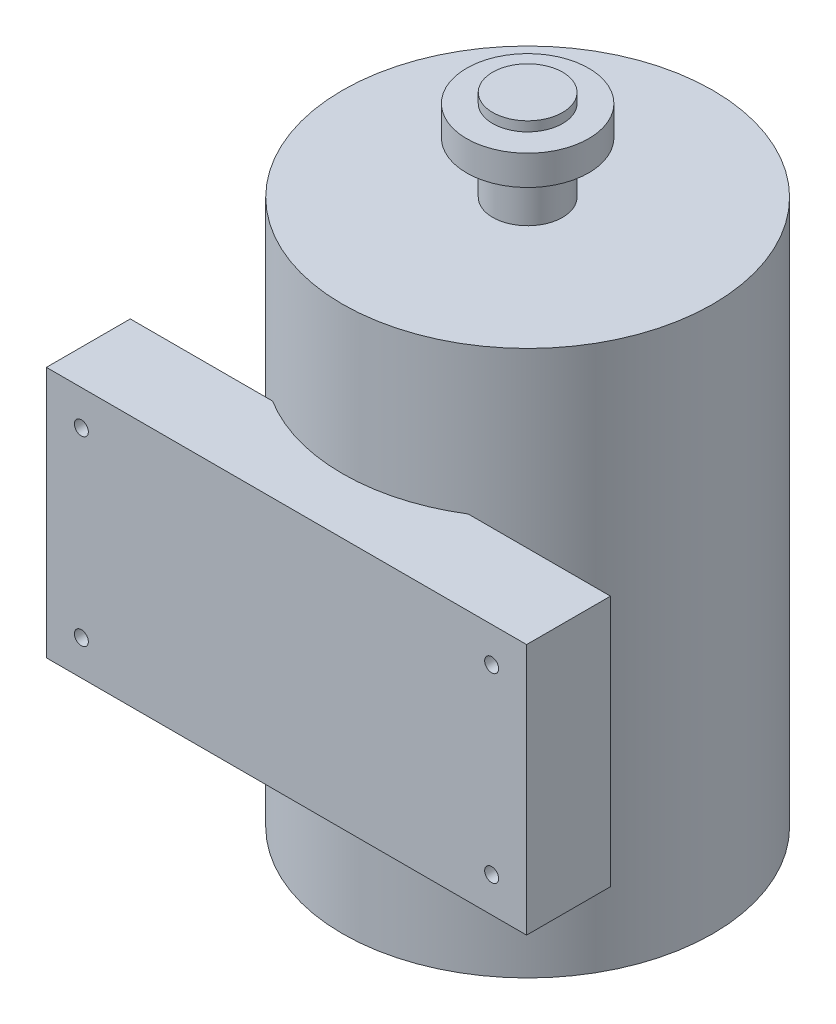
ISO-10303-21;
HEADER;
FILE_DESCRIPTION(('STEP AP214'),'2;1');
FILE_NAME('part.step','',(''),(''),'','','');
FILE_SCHEMA(('AUTOMOTIVE_DESIGN { 1 0 10303 214 1 1 1 1 }'));
ENDSEC;
DATA;
#1=APPLICATION_CONTEXT('core data for automotive mechanical design processes');
#2=APPLICATION_PROTOCOL_DEFINITION('international standard','automotive_design',2000,#1);
#3=PRODUCT_CONTEXT('',#1,'mechanical');
#4=PRODUCT('Part','Part','',(#3));
#5=PRODUCT_RELATED_PRODUCT_CATEGORY('part','',(#4));
#6=PRODUCT_DEFINITION_FORMATION('','',#4);
#7=PRODUCT_DEFINITION_CONTEXT('part definition',#1,'design');
#8=PRODUCT_DEFINITION('design','',#6,#7);
#9=PRODUCT_DEFINITION_SHAPE('','',#8);
#10=(LENGTH_UNIT() NAMED_UNIT(*) SI_UNIT(.MILLI.,.METRE.));
#11=(NAMED_UNIT(*) PLANE_ANGLE_UNIT() SI_UNIT($,.RADIAN.));
#12=(NAMED_UNIT(*) SI_UNIT($,.STERADIAN.) SOLID_ANGLE_UNIT());
#13=UNCERTAINTY_MEASURE_WITH_UNIT(LENGTH_MEASURE(1.E-05),#10,'distance_accuracy_value','');
#14=(GEOMETRIC_REPRESENTATION_CONTEXT(3) GLOBAL_UNCERTAINTY_ASSIGNED_CONTEXT((#13)) GLOBAL_UNIT_ASSIGNED_CONTEXT((#10,
#11,#12)) REPRESENTATION_CONTEXT('',''));
#15=CARTESIAN_POINT('',(0.,0.,0.));
#16=DIRECTION('',(0.,0.,1.));
#17=DIRECTION('',(1.,0.,0.));
#18=AXIS2_PLACEMENT_3D('',#15,#16,#17);
#19=CARTESIAN_POINT('',(0.,78.,0.));
#20=DIRECTION('',(0.,-1.,0.));
#21=DIRECTION('',(0.,0.,-1.));
#22=AXIS2_PLACEMENT_3D('',#19,#20,#21);
#23=CYLINDRICAL_SURFACE('',#22,53.);
#24=CARTESIAN_POINT('',(0.,-78.,0.));
#25=DIRECTION('',(0.,1.,0.));
#26=DIRECTION('',(0.,0.,1.));
#27=AXIS2_PLACEMENT_3D('',#24,#25,#26);
#28=CIRCLE('',#27,53.);
#29=CARTESIAN_POINT('',(0.,-78.,53.));
#30=VERTEX_POINT('',#29);
#31=EDGE_CURVE('E125',#30,#30,#28,.T.);
#32=ORIENTED_EDGE('',*,*,#31,.T.);
#33=EDGE_LOOP('',(#32));
#34=FACE_BOUND('',#33,.T.);
#35=CARTESIAN_POINT('',(0.,78.,0.));
#36=DIRECTION('',(0.,1.,0.));
#37=DIRECTION('',(0.,0.,1.));
#38=AXIS2_PLACEMENT_3D('',#35,#36,#37);
#39=CIRCLE('',#38,53.);
#40=CARTESIAN_POINT('',(0.,78.,53.));
#41=VERTEX_POINT('',#40);
#42=EDGE_CURVE('E130',#41,#41,#39,.T.);
#43=ORIENTED_EDGE('',*,*,#42,.F.);
#44=EDGE_LOOP('',(#43));
#45=FACE_BOUND('',#44,.T.);
#46=DIRECTION('',(0.,-1.,0.));
#47=VECTOR('',#46,1.);
#48=CARTESIAN_POINT('',(-27.9999999999997,78.,45.0000000000002));
#49=LINE('',#48,#47);
#50=CARTESIAN_POINT('',(-27.9999999999997,36.,45.0000000000002));
#51=VERTEX_POINT('',#50);
#52=CARTESIAN_POINT('',(-27.9999999999997,-36.,45.0000000000002));
#53=VERTEX_POINT('',#52);
#54=EDGE_CURVE('E11',#51,#53,#49,.T.);
#55=ORIENTED_EDGE('',*,*,#54,.F.);
#56=CARTESIAN_POINT('',(0.,36.,0.));
#57=DIRECTION('',(0.,-1.,0.));
#58=DIRECTION('',(1.,0.,0.));
#59=AXIS2_PLACEMENT_3D('',#56,#57,#58);
#60=CIRCLE('',#59,53.);
#61=CARTESIAN_POINT('',(28.0000000000003,36.,44.9999999999998));
#62=VERTEX_POINT('',#61);
#63=EDGE_CURVE('E141',#62,#51,#60,.T.);
#64=ORIENTED_EDGE('',*,*,#63,.F.);
#65=DIRECTION('',(0.,-1.,0.));
#66=VECTOR('',#65,1.);
#67=CARTESIAN_POINT('',(28.0000000000003,78.,44.9999999999998));
#68=LINE('',#67,#66);
#69=CARTESIAN_POINT('',(28.0000000000003,-36.,44.9999999999998));
#70=VERTEX_POINT('',#69);
#71=EDGE_CURVE('E137',#70,#62,#68,.F.);
#72=ORIENTED_EDGE('',*,*,#71,.F.);
#73=CARTESIAN_POINT('',(0.,-36.,0.));
#74=DIRECTION('',(0.,1.,0.));
#75=DIRECTION('',(-1.,0.,0.));
#76=AXIS2_PLACEMENT_3D('',#73,#74,#75);
#77=CIRCLE('',#76,53.);
#78=EDGE_CURVE('E43',#53,#70,#77,.T.);
#79=ORIENTED_EDGE('',*,*,#78,.F.);
#80=EDGE_LOOP('',(#55,#64,#72,#79));
#81=FACE_BOUND('',#80,.T.);
#82=ADVANCED_FACE('F36',(#34,#45,#81),#23,.T.);
#83=CARTESIAN_POINT('',(0.,104.,0.));
#84=DIRECTION('',(0.,-1.,0.));
#85=DIRECTION('',(0.,0.,-1.));
#86=AXIS2_PLACEMENT_3D('',#83,#84,#85);
#87=CYLINDRICAL_SURFACE('',#86,10.);
#88=CARTESIAN_POINT('',(0.,78.,0.));
#89=DIRECTION('',(0.,1.,0.));
#90=DIRECTION('',(0.,0.,1.));
#91=AXIS2_PLACEMENT_3D('',#88,#89,#90);
#92=CIRCLE('',#91,10.);
#93=CARTESIAN_POINT('',(0.,78.,-10.));
#94=VERTEX_POINT('',#93);
#95=EDGE_CURVE('E126',#94,#94,#92,.T.);
#96=CARTESIAN_POINT('',(0.,92.75,0.));
#97=DIRECTION('',(0.,1.,0.));
#98=DIRECTION('',(0.,0.,1.));
#99=AXIS2_PLACEMENT_3D('',#96,#97,#98);
#100=CIRCLE('',#99,10.);
#101=CARTESIAN_POINT('',(0.,92.75,-10.));
#102=VERTEX_POINT('',#101);
#103=EDGE_CURVE('E129',#102,#102,#100,.T.);
#104=CARTESIAN_POINT('',(0.,78.,-10.));
#105=CARTESIAN_POINT('',(0.,78.1536458333333,-10.));
#106=CARTESIAN_POINT('',(0.,78.3072916666667,-10.));
#107=CARTESIAN_POINT('',(0.,78.6145833333333,-10.));
#108=CARTESIAN_POINT('',(0.,78.7682291666667,-10.));
#109=CARTESIAN_POINT('',(0.,79.0755208333333,-10.));
#110=CARTESIAN_POINT('',(0.,79.2291666666667,-10.));
#111=CARTESIAN_POINT('',(0.,79.5364583333333,-10.));
#112=CARTESIAN_POINT('',(0.,79.6901041666667,-10.));
#113=CARTESIAN_POINT('',(0.,79.9973958333333,-10.));
#114=CARTESIAN_POINT('',(0.,80.1510416666667,-10.));
#115=CARTESIAN_POINT('',(0.,80.4583333333333,-10.));
#116=CARTESIAN_POINT('',(0.,80.6119791666667,-10.));
#117=CARTESIAN_POINT('',(0.,80.9192708333333,-10.));
#118=CARTESIAN_POINT('',(0.,81.0729166666667,-10.));
#119=CARTESIAN_POINT('',(0.,81.3802083333333,-10.));
#120=CARTESIAN_POINT('',(0.,81.5338541666667,-10.));
#121=CARTESIAN_POINT('',(0.,81.8411458333333,-10.));
#122=CARTESIAN_POINT('',(0.,81.9947916666667,-10.));
#123=CARTESIAN_POINT('',(0.,82.3020833333333,-10.));
#124=CARTESIAN_POINT('',(0.,82.4557291666667,-10.));
#125=CARTESIAN_POINT('',(0.,82.7630208333333,-10.));
#126=CARTESIAN_POINT('',(0.,82.9166666666667,-10.));
#127=CARTESIAN_POINT('',(0.,83.2239583333333,-10.));
#128=CARTESIAN_POINT('',(0.,83.3776041666667,-10.));
#129=CARTESIAN_POINT('',(0.,83.6848958333333,-10.));
#130=CARTESIAN_POINT('',(0.,83.8385416666667,-10.));
#131=CARTESIAN_POINT('',(0.,84.1458333333333,-10.));
#132=CARTESIAN_POINT('',(0.,84.2994791666667,-10.));
#133=CARTESIAN_POINT('',(0.,84.6067708333333,-10.));
#134=CARTESIAN_POINT('',(0.,84.7604166666667,-10.));
#135=CARTESIAN_POINT('',(0.,85.0677083333333,-10.));
#136=CARTESIAN_POINT('',(0.,85.2213541666667,-10.));
#137=CARTESIAN_POINT('',(0.,85.5286458333333,-10.));
#138=CARTESIAN_POINT('',(0.,85.6822916666667,-10.));
#139=CARTESIAN_POINT('',(0.,85.9895833333333,-10.));
#140=CARTESIAN_POINT('',(0.,86.1432291666667,-10.));
#141=CARTESIAN_POINT('',(0.,86.4505208333333,-10.));
#142=CARTESIAN_POINT('',(0.,86.6041666666667,-10.));
#143=CARTESIAN_POINT('',(0.,86.9114583333333,-10.));
#144=CARTESIAN_POINT('',(0.,87.0651041666667,-10.));
#145=CARTESIAN_POINT('',(0.,87.3723958333333,-10.));
#146=CARTESIAN_POINT('',(0.,87.5260416666667,-10.));
#147=CARTESIAN_POINT('',(0.,87.8333333333333,-10.));
#148=CARTESIAN_POINT('',(0.,87.9869791666667,-10.));
#149=CARTESIAN_POINT('',(0.,88.2942708333333,-10.));
#150=CARTESIAN_POINT('',(0.,88.4479166666667,-10.));
#151=CARTESIAN_POINT('',(0.,88.7552083333333,-10.));
#152=CARTESIAN_POINT('',(0.,88.9088541666667,-10.));
#153=CARTESIAN_POINT('',(0.,89.2161458333333,-10.));
#154=CARTESIAN_POINT('',(0.,89.3697916666667,-10.));
#155=CARTESIAN_POINT('',(0.,89.6770833333333,-10.));
#156=CARTESIAN_POINT('',(0.,89.8307291666667,-10.));
#157=CARTESIAN_POINT('',(0.,90.1380208333333,-10.));
#158=CARTESIAN_POINT('',(0.,90.2916666666667,-10.));
#159=CARTESIAN_POINT('',(0.,90.5989583333333,-10.));
#160=CARTESIAN_POINT('',(0.,90.7526041666667,-10.));
#161=CARTESIAN_POINT('',(0.,91.0598958333333,-10.));
#162=CARTESIAN_POINT('',(0.,91.2135416666667,-10.));
#163=CARTESIAN_POINT('',(0.,91.5208333333333,-10.));
#164=CARTESIAN_POINT('',(0.,91.6744791666667,-10.));
#165=CARTESIAN_POINT('',(0.,91.9817708333333,-10.));
#166=CARTESIAN_POINT('',(0.,92.1354166666667,-10.));
#167=CARTESIAN_POINT('',(0.,92.4427083333333,-10.));
#168=CARTESIAN_POINT('',(0.,92.5963541666667,-10.));
#169=CARTESIAN_POINT('',(0.,92.75,-10.));
#170=B_SPLINE_CURVE_WITH_KNOTS('',3,(#104,#105,#106,#107,#108,#109,#110,#111,#112,#113,#114,
#115,#116,#117,#118,#119,#120,#121,#122,#123,#124,#125,#126,#127,#128,#129,#130,#131,#132,#133,
#134,#135,#136,#137,#138,#139,#140,#141,#142,#143,#144,#145,#146,#147,#148,#149,#150,#151,#152,
#153,#154,#155,#156,#157,#158,#159,#160,#161,#162,#163,#164,#165,#166,#167,#168,#169),
.UNSPECIFIED.,.F.,.F.,(4,2,2,2,2,2,2,2,2,2,2,2,2,2,2,2,2,2,2,2,2,2,2,2,2,2,2,2,2,2,2,2,4),(0.,
0.460937499999994,0.921875000000003,1.3828125,1.84374999999999,2.3046875,2.76562499999999,
3.22656249999999,3.6875,4.14843749999999,4.609375,5.07031249999999,5.53125,5.9921875,
6.45312499999999,6.9140625,7.37499999999999,7.83593749999999,8.29687499999999,8.75781249999999,
9.21875,9.67968749999999,10.140625,10.6015625,11.0625,11.5234375,11.984375,12.4453125,12.90625,
13.3671875,13.828125,14.2890625,14.75),.UNSPECIFIED.);
#171=EDGE_CURVE('BSEAM179',#94,#102,#170,.T.);
#172=ORIENTED_EDGE('',*,*,#95,.T.);
#173=ORIENTED_EDGE('',*,*,#103,.F.);
#174=ORIENTED_EDGE('',*,*,#171,.T.);
#175=ORIENTED_EDGE('',*,*,#171,.F.);
#176=EDGE_LOOP('',(#172,#174,#173,#175));
#177=FACE_BOUND('',#176,.T.);
#178=ADVANCED_FACE('F179',(#177),#87,.T.);
#179=CARTESIAN_POINT('',(0.,78.,0.));
#180=DIRECTION('',(0.,1.,0.));
#181=DIRECTION('',(0.,0.,1.));
#182=AXIS2_PLACEMENT_3D('',#179,#180,#181);
#183=PLANE('',#182);
#184=ORIENTED_EDGE('',*,*,#95,.F.);
#185=EDGE_LOOP('',(#184));
#186=FACE_BOUND('',#185,.T.);
#187=ORIENTED_EDGE('',*,*,#42,.T.);
#188=EDGE_LOOP('',(#187));
#189=FACE_BOUND('',#188,.T.);
#190=ADVANCED_FACE('F184',(#186,#189),#183,.T.);
#191=CARTESIAN_POINT('',(0.,-78.,0.));
#192=DIRECTION('',(0.,1.,0.));
#193=DIRECTION('',(0.,0.,1.));
#194=AXIS2_PLACEMENT_3D('',#191,#192,#193);
#195=PLANE('',#194);
#196=ORIENTED_EDGE('',*,*,#31,.F.);
#197=EDGE_LOOP('',(#196));
#198=FACE_BOUND('',#197,.T.);
#199=ADVANCED_FACE('F193',(#198),#195,.F.);
#200=CARTESIAN_POINT('',(0.,101.25,0.));
#201=DIRECTION('',(0.,-1.,0.));
#202=DIRECTION('',(0.,0.,-1.));
#203=AXIS2_PLACEMENT_3D('',#200,#201,#202);
#204=CYLINDRICAL_SURFACE('',#203,17.4625);
#205=CARTESIAN_POINT('',(0.,101.25,0.));
#206=DIRECTION('',(0.,1.,0.));
#207=DIRECTION('',(0.,0.,1.));
#208=AXIS2_PLACEMENT_3D('',#205,#206,#207);
#209=CIRCLE('',#208,17.4625);
#210=CARTESIAN_POINT('',(0.,101.25,17.4625));
#211=VERTEX_POINT('',#210);
#212=EDGE_CURVE('E112',#211,#211,#209,.T.);
#213=ORIENTED_EDGE('',*,*,#212,.F.);
#214=EDGE_LOOP('',(#213));
#215=FACE_BOUND('',#214,.T.);
#216=CARTESIAN_POINT('',(0.,92.75,0.));
#217=DIRECTION('',(0.,1.,0.));
#218=DIRECTION('',(0.,0.,1.));
#219=AXIS2_PLACEMENT_3D('',#216,#217,#218);
#220=CIRCLE('',#219,17.4625);
#221=CARTESIAN_POINT('',(0.,92.75,17.4625));
#222=VERTEX_POINT('',#221);
#223=EDGE_CURVE('E108',#222,#222,#220,.T.);
#224=ORIENTED_EDGE('',*,*,#223,.T.);
#225=EDGE_LOOP('',(#224));
#226=FACE_BOUND('',#225,.T.);
#227=ADVANCED_FACE('F199',(#215,#226),#204,.T.);
#228=CARTESIAN_POINT('',(0.,101.25,0.));
#229=DIRECTION('',(0.,1.,0.));
#230=DIRECTION('',(0.,0.,1.));
#231=AXIS2_PLACEMENT_3D('',#228,#229,#230);
#232=PLANE('',#231);
#233=CARTESIAN_POINT('',(0.,101.25,0.));
#234=DIRECTION('',(0.,1.,0.));
#235=DIRECTION('',(0.,0.,1.));
#236=AXIS2_PLACEMENT_3D('',#233,#234,#235);
#237=CIRCLE('',#236,10.);
#238=CARTESIAN_POINT('',(0.,101.25,-10.));
#239=VERTEX_POINT('',#238);
#240=EDGE_CURVE('E120',#239,#239,#237,.T.);
#241=ORIENTED_EDGE('',*,*,#240,.F.);
#242=EDGE_LOOP('',(#241));
#243=FACE_BOUND('',#242,.T.);
#244=ORIENTED_EDGE('',*,*,#212,.T.);
#245=EDGE_LOOP('',(#244));
#246=FACE_BOUND('',#245,.T.);
#247=ADVANCED_FACE('F212',(#243,#246),#232,.T.);
#248=CARTESIAN_POINT('',(0.,92.75,0.));
#249=DIRECTION('',(0.,1.,0.));
#250=DIRECTION('',(0.,0.,1.));
#251=AXIS2_PLACEMENT_3D('',#248,#249,#250);
#252=PLANE('',#251);
#253=ORIENTED_EDGE('',*,*,#103,.T.);
#254=EDGE_LOOP('',(#253));
#255=FACE_BOUND('',#254,.T.);
#256=ORIENTED_EDGE('',*,*,#223,.F.);
#257=EDGE_LOOP('',(#256));
#258=FACE_BOUND('',#257,.T.);
#259=ADVANCED_FACE('F208',(#255,#258),#252,.F.);
#260=CARTESIAN_POINT('',(0.,104.,0.));
#261=DIRECTION('',(0.,1.,0.));
#262=DIRECTION('',(0.,0.,1.));
#263=AXIS2_PLACEMENT_3D('',#260,#261,#262);
#264=PLANE('',#263);
#265=CARTESIAN_POINT('',(0.,104.,0.));
#266=DIRECTION('',(0.,1.,0.));
#267=DIRECTION('',(0.,0.,1.));
#268=AXIS2_PLACEMENT_3D('',#265,#266,#267);
#269=CIRCLE('',#268,10.);
#270=CARTESIAN_POINT('',(0.,104.,-10.));
#271=VERTEX_POINT('',#270);
#272=EDGE_CURVE('E122',#271,#271,#269,.T.);
#273=ORIENTED_EDGE('',*,*,#272,.T.);
#274=EDGE_LOOP('',(#273));
#275=FACE_BOUND('',#274,.T.);
#276=ADVANCED_FACE('F204',(#275),#264,.T.);
#277=CARTESIAN_POINT('',(0.,101.25,-10.));
#278=CARTESIAN_POINT('',(0.,101.278645833333,-10.));
#279=CARTESIAN_POINT('',(0.,101.307291666667,-10.));
#280=CARTESIAN_POINT('',(0.,101.364583333333,-10.));
#281=CARTESIAN_POINT('',(0.,101.393229166667,-10.));
#282=CARTESIAN_POINT('',(0.,101.450520833333,-10.));
#283=CARTESIAN_POINT('',(0.,101.479166666667,-10.));
#284=CARTESIAN_POINT('',(0.,101.536458333333,-10.));
#285=CARTESIAN_POINT('',(0.,101.565104166667,-10.));
#286=CARTESIAN_POINT('',(0.,101.622395833333,-10.));
#287=CARTESIAN_POINT('',(0.,101.651041666667,-10.));
#288=CARTESIAN_POINT('',(0.,101.708333333333,-10.));
#289=CARTESIAN_POINT('',(0.,101.736979166667,-10.));
#290=CARTESIAN_POINT('',(0.,101.794270833333,-10.));
#291=CARTESIAN_POINT('',(0.,101.822916666667,-10.));
#292=CARTESIAN_POINT('',(0.,101.880208333333,-10.));
#293=CARTESIAN_POINT('',(0.,101.908854166667,-10.));
#294=CARTESIAN_POINT('',(0.,101.966145833333,-10.));
#295=CARTESIAN_POINT('',(0.,101.994791666667,-10.));
#296=CARTESIAN_POINT('',(0.,102.052083333333,-10.));
#297=CARTESIAN_POINT('',(0.,102.080729166667,-10.));
#298=CARTESIAN_POINT('',(0.,102.138020833333,-10.));
#299=CARTESIAN_POINT('',(0.,102.166666666667,-10.));
#300=CARTESIAN_POINT('',(0.,102.223958333333,-10.));
#301=CARTESIAN_POINT('',(0.,102.252604166667,-10.));
#302=CARTESIAN_POINT('',(0.,102.309895833333,-10.));
#303=CARTESIAN_POINT('',(0.,102.338541666667,-10.));
#304=CARTESIAN_POINT('',(0.,102.395833333333,-10.));
#305=CARTESIAN_POINT('',(0.,102.424479166667,-10.));
#306=CARTESIAN_POINT('',(0.,102.481770833333,-10.));
#307=CARTESIAN_POINT('',(0.,102.510416666667,-10.));
#308=CARTESIAN_POINT('',(0.,102.567708333333,-10.));
#309=CARTESIAN_POINT('',(0.,102.596354166667,-10.));
#310=CARTESIAN_POINT('',(0.,102.653645833333,-10.));
#311=CARTESIAN_POINT('',(0.,102.682291666667,-10.));
#312=CARTESIAN_POINT('',(0.,102.739583333333,-10.));
#313=CARTESIAN_POINT('',(0.,102.768229166667,-10.));
#314=CARTESIAN_POINT('',(0.,102.825520833333,-10.));
#315=CARTESIAN_POINT('',(0.,102.854166666667,-10.));
#316=CARTESIAN_POINT('',(0.,102.911458333333,-10.));
#317=CARTESIAN_POINT('',(0.,102.940104166667,-10.));
#318=CARTESIAN_POINT('',(0.,102.997395833333,-10.));
#319=CARTESIAN_POINT('',(0.,103.026041666667,-10.));
#320=CARTESIAN_POINT('',(0.,103.083333333333,-10.));
#321=CARTESIAN_POINT('',(0.,103.111979166667,-10.));
#322=CARTESIAN_POINT('',(0.,103.169270833333,-10.));
#323=CARTESIAN_POINT('',(0.,103.197916666667,-10.));
#324=CARTESIAN_POINT('',(0.,103.255208333333,-10.));
#325=CARTESIAN_POINT('',(0.,103.283854166667,-10.));
#326=CARTESIAN_POINT('',(0.,103.341145833333,-10.));
#327=CARTESIAN_POINT('',(0.,103.369791666667,-10.));
#328=CARTESIAN_POINT('',(0.,103.427083333333,-10.));
#329=CARTESIAN_POINT('',(0.,103.455729166667,-10.));
#330=CARTESIAN_POINT('',(0.,103.513020833333,-10.));
#331=CARTESIAN_POINT('',(0.,103.541666666667,-10.));
#332=CARTESIAN_POINT('',(0.,103.598958333333,-10.));
#333=CARTESIAN_POINT('',(0.,103.627604166667,-10.));
#334=CARTESIAN_POINT('',(0.,103.684895833333,-10.));
#335=CARTESIAN_POINT('',(0.,103.713541666667,-10.));
#336=CARTESIAN_POINT('',(0.,103.770833333333,-10.));
#337=CARTESIAN_POINT('',(0.,103.799479166667,-10.));
#338=CARTESIAN_POINT('',(0.,103.856770833333,-10.));
#339=CARTESIAN_POINT('',(0.,103.885416666667,-10.));
#340=CARTESIAN_POINT('',(0.,103.942708333333,-10.));
#341=CARTESIAN_POINT('',(0.,103.971354166667,-10.));
#342=CARTESIAN_POINT('',(0.,104.,-10.));
#343=B_SPLINE_CURVE_WITH_KNOTS('',3,(#277,#278,#279,#280,#281,#282,#283,#284,#285,#286,#287,
#288,#289,#290,#291,#292,#293,#294,#295,#296,#297,#298,#299,#300,#301,#302,#303,#304,#305,#306,
#307,#308,#309,#310,#311,#312,#313,#314,#315,#316,#317,#318,#319,#320,#321,#322,#323,#324,#325,
#326,#327,#328,#329,#330,#331,#332,#333,#334,#335,#336,#337,#338,#339,#340,#341,#342),
.UNSPECIFIED.,.F.,.F.,(4,2,2,2,2,2,2,2,2,2,2,2,2,2,2,2,2,2,2,2,2,2,2,2,2,2,2,2,2,2,2,2,4),(0.,
0.0859375000000079,0.171875000000002,0.25781250000001,0.343750000000004,0.429687500000012,
0.515625000000006,0.6015625,0.687500000000008,0.773437500000002,0.859375000000009,
0.945312500000003,1.03125,1.11718750000001,1.203125,1.28906250000001,1.375,1.4609375,1.546875,
1.6328125,1.71875,1.8046875,1.89062499999999,1.9765625,2.06249999999999,2.1484375,2.234375,
2.32031249999999,2.40625,2.49218749999999,2.578125,2.66406249999999,2.75),.UNSPECIFIED.);
#344=EDGE_CURVE('BSEAM187',#239,#271,#343,.T.);
#345=ORIENTED_EDGE('',*,*,#240,.T.);
#346=ORIENTED_EDGE('',*,*,#272,.F.);
#347=ORIENTED_EDGE('',*,*,#344,.T.);
#348=ORIENTED_EDGE('',*,*,#344,.F.);
#349=EDGE_LOOP('',(#345,#347,#346,#348));
#350=FACE_BOUND('',#349,.T.);
#351=ADVANCED_FACE('F187',(#350),#87,.T.);
#352=CARTESIAN_POINT('',(3.20252528280972E-13,0.,45.));
#353=DIRECTION('',(0.,0.,1.));
#354=DIRECTION('',(1.,0.,0.));
#355=AXIS2_PLACEMENT_3D('',#352,#353,#354);
#356=PLANE('',#355);
#357=CARTESIAN_POINT('',(-58.6999999999995,26.,45.));
#358=DIRECTION('',(0.,0.,1.));
#359=DIRECTION('',(1.,0.,0.));
#360=AXIS2_PLACEMENT_3D('',#357,#358,#359);
#361=CIRCLE('',#360,2.);
#362=CARTESIAN_POINT('',(-56.6999999999995,26.,45.));
#363=VERTEX_POINT('',#362);
#364=EDGE_CURVE('E259',#363,#363,#361,.T.);
#365=ORIENTED_EDGE('',*,*,#364,.T.);
#366=EDGE_LOOP('',(#365));
#367=FACE_BOUND('',#366,.T.);
#368=CARTESIAN_POINT('',(-58.6999999999995,-26.,45.));
#369=DIRECTION('',(0.,0.,1.));
#370=DIRECTION('',(1.,0.,0.));
#371=AXIS2_PLACEMENT_3D('',#368,#369,#370);
#372=CIRCLE('',#371,2.);
#373=CARTESIAN_POINT('',(-56.6999999999995,-26.,45.));
#374=VERTEX_POINT('',#373);
#375=EDGE_CURVE('E159',#374,#374,#372,.T.);
#376=ORIENTED_EDGE('',*,*,#375,.T.);
#377=EDGE_LOOP('',(#376));
#378=FACE_BOUND('',#377,.T.);
#379=DIRECTION('',(1.,0.,0.));
#380=VECTOR('',#379,1.);
#381=CARTESIAN_POINT('',(-68.6999999999997,36.,45.0000000000005));
#382=LINE('',#381,#380);
#383=CARTESIAN_POINT('',(-68.6999999999997,36.,45.0000000000005));
#384=VERTEX_POINT('',#383);
#385=EDGE_CURVE('E147',#384,#51,#382,.T.);
#386=ORIENTED_EDGE('',*,*,#385,.T.);
#387=ORIENTED_EDGE('',*,*,#54,.T.);
#388=DIRECTION('',(-1.,0.,0.));
#389=VECTOR('',#388,1.);
#390=CARTESIAN_POINT('',(-68.6999999999997,-36.,45.0000000000005));
#391=LINE('',#390,#389);
#392=CARTESIAN_POINT('',(-68.6999999999997,-36.,45.0000000000005));
#393=VERTEX_POINT('',#392);
#394=EDGE_CURVE('E93',#53,#393,#391,.T.);
#395=ORIENTED_EDGE('',*,*,#394,.T.);
#396=DIRECTION('',(0.,1.,0.));
#397=VECTOR('',#396,1.);
#398=CARTESIAN_POINT('',(-68.6999999999997,36.,45.0000000000005));
#399=LINE('',#398,#397);
#400=EDGE_CURVE('E92',#393,#384,#399,.T.);
#401=ORIENTED_EDGE('',*,*,#400,.T.);
#402=EDGE_LOOP('',(#386,#387,#395,#401));
#403=FACE_BOUND('',#402,.T.);
#404=ADVANCED_FACE('F149',(#367,#378,#403),#356,.F.);
#405=CARTESIAN_POINT('',(58.7000000000005,-26.,45.));
#406=DIRECTION('',(0.,0.,1.));
#407=DIRECTION('',(1.,0.,0.));
#408=AXIS2_PLACEMENT_3D('',#405,#406,#407);
#409=CIRCLE('',#408,2.);
#410=CARTESIAN_POINT('',(60.7000000000005,-26.,45.));
#411=VERTEX_POINT('',#410);
#412=EDGE_CURVE('E267',#411,#411,#409,.T.);
#413=ORIENTED_EDGE('',*,*,#412,.T.);
#414=EDGE_LOOP('',(#413));
#415=FACE_BOUND('',#414,.T.);
#416=CARTESIAN_POINT('',(58.7000000000005,26.,45.));
#417=DIRECTION('',(0.,0.,1.));
#418=DIRECTION('',(1.,0.,0.));
#419=AXIS2_PLACEMENT_3D('',#416,#417,#418);
#420=CIRCLE('',#419,2.);
#421=CARTESIAN_POINT('',(60.7000000000005,26.,45.));
#422=VERTEX_POINT('',#421);
#423=EDGE_CURVE('E270',#422,#422,#420,.T.);
#424=ORIENTED_EDGE('',*,*,#423,.T.);
#425=EDGE_LOOP('',(#424));
#426=FACE_BOUND('',#425,.T.);
#427=CARTESIAN_POINT('',(68.7000000000003,-36.,44.9999999999995));
#428=VERTEX_POINT('',#427);
#429=EDGE_CURVE('E83',#428,#70,#391,.T.);
#430=ORIENTED_EDGE('',*,*,#429,.T.);
#431=ORIENTED_EDGE('',*,*,#71,.T.);
#432=CARTESIAN_POINT('',(68.7000000000003,36.,44.9999999999995));
#433=VERTEX_POINT('',#432);
#434=EDGE_CURVE('E99',#62,#433,#382,.T.);
#435=ORIENTED_EDGE('',*,*,#434,.T.);
#436=DIRECTION('',(0.,-1.,0.));
#437=VECTOR('',#436,1.);
#438=CARTESIAN_POINT('',(68.7000000000003,36.,44.9999999999995));
#439=LINE('',#438,#437);
#440=EDGE_CURVE('E96',#433,#428,#439,.T.);
#441=ORIENTED_EDGE('',*,*,#440,.T.);
#442=EDGE_LOOP('',(#430,#431,#435,#441));
#443=FACE_BOUND('',#442,.T.);
#444=ADVANCED_FACE('F97',(#415,#426,#443),#356,.F.);
#445=CARTESIAN_POINT('',(68.7000000000003,36.,44.9999999999995));
#446=DIRECTION('',(-1.,0.,0.));
#447=DIRECTION('',(0.,0.,1.));
#448=AXIS2_PLACEMENT_3D('',#445,#446,#447);
#449=PLANE('',#448);
#450=DIRECTION('',(0.,-1.,0.));
#451=VECTOR('',#450,1.);
#452=CARTESIAN_POINT('',(68.7000000000005,36.,68.9999999999995));
#453=LINE('',#452,#451);
#454=CARTESIAN_POINT('',(68.7000000000005,36.,68.9999999999995));
#455=VERTEX_POINT('',#454);
#456=CARTESIAN_POINT('',(68.7000000000005,-36.,68.9999999999995));
#457=VERTEX_POINT('',#456);
#458=EDGE_CURVE('E107',#455,#457,#453,.T.);
#459=ORIENTED_EDGE('',*,*,#458,.T.);
#460=DIRECTION('',(0.,0.,1.));
#461=VECTOR('',#460,1.);
#462=CARTESIAN_POINT('',(68.7000000000003,-36.,44.9999999999995));
#463=LINE('',#462,#461);
#464=EDGE_CURVE('E88',#428,#457,#463,.T.);
#465=ORIENTED_EDGE('',*,*,#464,.F.);
#466=ORIENTED_EDGE('',*,*,#440,.F.);
#467=DIRECTION('',(0.,0.,1.));
#468=VECTOR('',#467,1.);
#469=CARTESIAN_POINT('',(68.7000000000003,36.,44.9999999999995));
#470=LINE('',#469,#468);
#471=EDGE_CURVE('E152',#433,#455,#470,.T.);
#472=ORIENTED_EDGE('',*,*,#471,.T.);
#473=EDGE_LOOP('',(#459,#465,#466,#472));
#474=FACE_BOUND('',#473,.T.);
#475=ADVANCED_FACE('F105',(#474),#449,.F.);
#476=CARTESIAN_POINT('',(-68.6999999999997,-36.,45.0000000000005));
#477=DIRECTION('',(0.,1.,0.));
#478=DIRECTION('',(-1.,0.,0.));
#479=AXIS2_PLACEMENT_3D('',#476,#477,#478);
#480=PLANE('',#479);
#481=ORIENTED_EDGE('',*,*,#394,.F.);
#482=ORIENTED_EDGE('',*,*,#78,.T.);
#483=ORIENTED_EDGE('',*,*,#429,.F.);
#484=ORIENTED_EDGE('',*,*,#464,.T.);
#485=DIRECTION('',(-1.,0.,0.));
#486=VECTOR('',#485,1.);
#487=CARTESIAN_POINT('',(-68.6999999999995,-36.,69.0000000000005));
#488=LINE('',#487,#486);
#489=CARTESIAN_POINT('',(-68.6999999999995,-36.,69.0000000000005));
#490=VERTEX_POINT('',#489);
#491=EDGE_CURVE('E158',#457,#490,#488,.T.);
#492=ORIENTED_EDGE('',*,*,#491,.T.);
#493=DIRECTION('',(0.,0.,1.));
#494=VECTOR('',#493,1.);
#495=CARTESIAN_POINT('',(-68.6999999999997,-36.,45.0000000000005));
#496=LINE('',#495,#494);
#497=EDGE_CURVE('E109',#393,#490,#496,.T.);
#498=ORIENTED_EDGE('',*,*,#497,.F.);
#499=EDGE_LOOP('',(#481,#482,#483,#484,#492,#498));
#500=FACE_BOUND('',#499,.T.);
#501=ADVANCED_FACE('F86',(#500),#480,.F.);
#502=CARTESIAN_POINT('',(-68.6999999999997,36.,45.0000000000005));
#503=DIRECTION('',(1.,0.,0.));
#504=DIRECTION('',(0.,0.,-1.));
#505=AXIS2_PLACEMENT_3D('',#502,#503,#504);
#506=PLANE('',#505);
#507=DIRECTION('',(0.,1.,0.));
#508=VECTOR('',#507,1.);
#509=CARTESIAN_POINT('',(-68.6999999999995,36.,69.0000000000005));
#510=LINE('',#509,#508);
#511=CARTESIAN_POINT('',(-68.6999999999995,36.,69.0000000000005));
#512=VERTEX_POINT('',#511);
#513=EDGE_CURVE('E161',#490,#512,#510,.T.);
#514=ORIENTED_EDGE('',*,*,#513,.T.);
#515=DIRECTION('',(0.,0.,1.));
#516=VECTOR('',#515,1.);
#517=CARTESIAN_POINT('',(-68.6999999999997,36.,45.0000000000005));
#518=LINE('',#517,#516);
#519=EDGE_CURVE('E115',#384,#512,#518,.T.);
#520=ORIENTED_EDGE('',*,*,#519,.F.);
#521=ORIENTED_EDGE('',*,*,#400,.F.);
#522=ORIENTED_EDGE('',*,*,#497,.T.);
#523=EDGE_LOOP('',(#514,#520,#521,#522));
#524=FACE_BOUND('',#523,.T.);
#525=ADVANCED_FACE('F169',(#524),#506,.F.);
#526=CARTESIAN_POINT('',(-68.6999999999997,36.,45.0000000000005));
#527=DIRECTION('',(0.,-1.,0.));
#528=DIRECTION('',(1.,0.,0.));
#529=AXIS2_PLACEMENT_3D('',#526,#527,#528);
#530=PLANE('',#529);
#531=ORIENTED_EDGE('',*,*,#434,.F.);
#532=ORIENTED_EDGE('',*,*,#63,.T.);
#533=ORIENTED_EDGE('',*,*,#385,.F.);
#534=ORIENTED_EDGE('',*,*,#519,.T.);
#535=DIRECTION('',(1.,0.,0.));
#536=VECTOR('',#535,1.);
#537=CARTESIAN_POINT('',(-68.6999999999995,36.,69.0000000000005));
#538=LINE('',#537,#536);
#539=EDGE_CURVE('E103',#512,#455,#538,.T.);
#540=ORIENTED_EDGE('',*,*,#539,.T.);
#541=ORIENTED_EDGE('',*,*,#471,.F.);
#542=EDGE_LOOP('',(#531,#532,#533,#534,#540,#541));
#543=FACE_BOUND('',#542,.T.);
#544=ADVANCED_FACE('F145',(#543),#530,.F.);
#545=CARTESIAN_POINT('',(4.87843632545443E-13,0.,69.));
#546=DIRECTION('',(0.,0.,1.));
#547=DIRECTION('',(1.,0.,0.));
#548=AXIS2_PLACEMENT_3D('',#545,#546,#547);
#549=PLANE('',#548);
#550=CARTESIAN_POINT('',(58.7000000000005,-26.,69.));
#551=DIRECTION('',(0.,0.,1.));
#552=DIRECTION('',(1.,0.,0.));
#553=AXIS2_PLACEMENT_3D('',#550,#551,#552);
#554=CIRCLE('',#553,2.);
#555=CARTESIAN_POINT('',(60.7000000000005,-26.,69.));
#556=VERTEX_POINT('',#555);
#557=EDGE_CURVE('E246',#556,#556,#554,.T.);
#558=ORIENTED_EDGE('',*,*,#557,.F.);
#559=EDGE_LOOP('',(#558));
#560=FACE_BOUND('',#559,.T.);
#561=CARTESIAN_POINT('',(58.7000000000005,26.,69.));
#562=DIRECTION('',(0.,0.,1.));
#563=DIRECTION('',(1.,0.,0.));
#564=AXIS2_PLACEMENT_3D('',#561,#562,#563);
#565=CIRCLE('',#564,2.);
#566=CARTESIAN_POINT('',(60.7000000000005,26.,69.));
#567=VERTEX_POINT('',#566);
#568=EDGE_CURVE('E250',#567,#567,#565,.T.);
#569=ORIENTED_EDGE('',*,*,#568,.F.);
#570=EDGE_LOOP('',(#569));
#571=FACE_BOUND('',#570,.T.);
#572=CARTESIAN_POINT('',(-58.6999999999995,26.,69.));
#573=DIRECTION('',(0.,0.,1.));
#574=DIRECTION('',(1.,0.,0.));
#575=AXIS2_PLACEMENT_3D('',#572,#573,#574);
#576=CIRCLE('',#575,2.);
#577=CARTESIAN_POINT('',(-56.6999999999995,26.,69.));
#578=VERTEX_POINT('',#577);
#579=EDGE_CURVE('E254',#578,#578,#576,.T.);
#580=ORIENTED_EDGE('',*,*,#579,.F.);
#581=EDGE_LOOP('',(#580));
#582=FACE_BOUND('',#581,.T.);
#583=CARTESIAN_POINT('',(-58.6999999999995,-26.,69.));
#584=DIRECTION('',(0.,0.,1.));
#585=DIRECTION('',(1.,0.,0.));
#586=AXIS2_PLACEMENT_3D('',#583,#584,#585);
#587=CIRCLE('',#586,2.);
#588=CARTESIAN_POINT('',(-56.6999999999995,-26.,69.));
#589=VERTEX_POINT('',#588);
#590=EDGE_CURVE('E257',#589,#589,#587,.T.);
#591=ORIENTED_EDGE('',*,*,#590,.F.);
#592=EDGE_LOOP('',(#591));
#593=FACE_BOUND('',#592,.T.);
#594=ORIENTED_EDGE('',*,*,#458,.F.);
#595=ORIENTED_EDGE('',*,*,#539,.F.);
#596=ORIENTED_EDGE('',*,*,#513,.F.);
#597=ORIENTED_EDGE('',*,*,#491,.F.);
#598=EDGE_LOOP('',(#594,#595,#596,#597));
#599=FACE_BOUND('',#598,.T.);
#600=ADVANCED_FACE('F167',(#560,#571,#582,#593,#599),#549,.T.);
#601=CARTESIAN_POINT('',(-58.6999999999995,-26.,45.));
#602=DIRECTION('',(0.,0.,1.));
#603=DIRECTION('',(1.,0.,0.));
#604=AXIS2_PLACEMENT_3D('',#601,#602,#603);
#605=CYLINDRICAL_SURFACE('',#604,2.);
#606=ORIENTED_EDGE('',*,*,#375,.F.);
#607=EDGE_LOOP('',(#606));
#608=FACE_BOUND('',#607,.T.);
#609=ORIENTED_EDGE('',*,*,#590,.T.);
#610=EDGE_LOOP('',(#609));
#611=FACE_BOUND('',#610,.T.);
#612=ADVANCED_FACE('F234',(#608,#611),#605,.F.);
#613=CARTESIAN_POINT('',(-58.6999999999995,26.,45.));
#614=DIRECTION('',(0.,0.,1.));
#615=DIRECTION('',(1.,0.,0.));
#616=AXIS2_PLACEMENT_3D('',#613,#614,#615);
#617=CYLINDRICAL_SURFACE('',#616,2.);
#618=ORIENTED_EDGE('',*,*,#364,.F.);
#619=EDGE_LOOP('',(#618));
#620=FACE_BOUND('',#619,.T.);
#621=ORIENTED_EDGE('',*,*,#579,.T.);
#622=EDGE_LOOP('',(#621));
#623=FACE_BOUND('',#622,.T.);
#624=ADVANCED_FACE('F241',(#620,#623),#617,.F.);
#625=CARTESIAN_POINT('',(58.7000000000005,26.,45.));
#626=DIRECTION('',(0.,0.,1.));
#627=DIRECTION('',(1.,0.,0.));
#628=AXIS2_PLACEMENT_3D('',#625,#626,#627);
#629=CYLINDRICAL_SURFACE('',#628,2.);
#630=ORIENTED_EDGE('',*,*,#423,.F.);
#631=EDGE_LOOP('',(#630));
#632=FACE_BOUND('',#631,.T.);
#633=ORIENTED_EDGE('',*,*,#568,.T.);
#634=EDGE_LOOP('',(#633));
#635=FACE_BOUND('',#634,.T.);
#636=ADVANCED_FACE('F275',(#632,#635),#629,.F.);
#637=CARTESIAN_POINT('',(58.7000000000005,-26.,45.));
#638=DIRECTION('',(0.,0.,1.));
#639=DIRECTION('',(1.,0.,0.));
#640=AXIS2_PLACEMENT_3D('',#637,#638,#639);
#641=CYLINDRICAL_SURFACE('',#640,2.);
#642=ORIENTED_EDGE('',*,*,#412,.F.);
#643=EDGE_LOOP('',(#642));
#644=FACE_BOUND('',#643,.T.);
#645=ORIENTED_EDGE('',*,*,#557,.T.);
#646=EDGE_LOOP('',(#645));
#647=FACE_BOUND('',#646,.T.);
#648=ADVANCED_FACE('F281',(#644,#647),#641,.F.);
#649=CLOSED_SHELL('',(#82,#178,#190,#199,#227,#247,#259,#276,#351,#404,#444,#475,#501,#525,#544,
#600,#612,#624,#636,#648));
#650=MANIFOLD_SOLID_BREP('B2',#649);
#651=ADVANCED_BREP_SHAPE_REPRESENTATION('',(#18,#650),#14);
#652=SHAPE_DEFINITION_REPRESENTATION(#9,#651);
ENDSEC;
END-ISO-10303-21;
